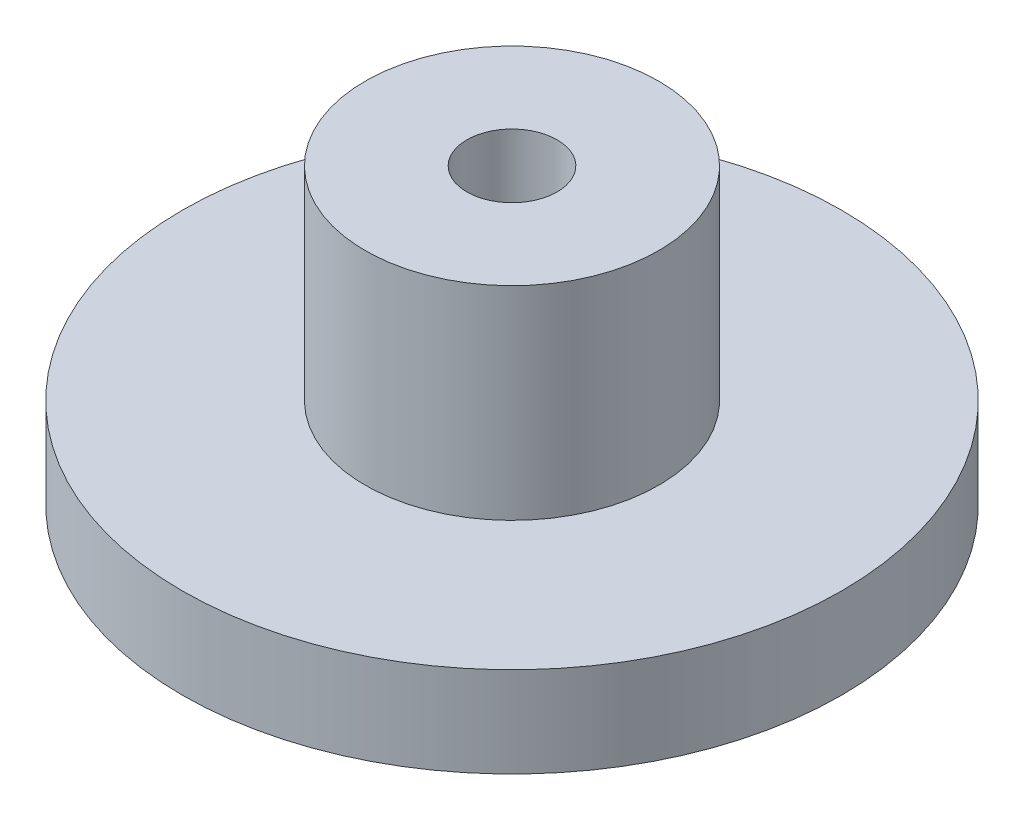
ISO-10303-21;
HEADER;
FILE_DESCRIPTION(('STEP AP214'),'2;1');
FILE_NAME('part.step','',(''),(''),'','','');
FILE_SCHEMA(('AUTOMOTIVE_DESIGN { 1 0 10303 214 1 1 1 1 }'));
ENDSEC;
DATA;
#1=APPLICATION_CONTEXT('core data for automotive mechanical design processes');
#2=APPLICATION_PROTOCOL_DEFINITION('international standard','automotive_design',2000,#1);
#3=PRODUCT_CONTEXT('',#1,'mechanical');
#4=PRODUCT('Part','Part','',(#3));
#5=PRODUCT_RELATED_PRODUCT_CATEGORY('part','',(#4));
#6=PRODUCT_DEFINITION_FORMATION('','',#4);
#7=PRODUCT_DEFINITION_CONTEXT('part definition',#1,'design');
#8=PRODUCT_DEFINITION('design','',#6,#7);
#9=PRODUCT_DEFINITION_SHAPE('','',#8);
#10=(LENGTH_UNIT() NAMED_UNIT(*) SI_UNIT(.MILLI.,.METRE.));
#11=(NAMED_UNIT(*) PLANE_ANGLE_UNIT() SI_UNIT($,.RADIAN.));
#12=(NAMED_UNIT(*) SI_UNIT($,.STERADIAN.) SOLID_ANGLE_UNIT());
#13=UNCERTAINTY_MEASURE_WITH_UNIT(LENGTH_MEASURE(1.E-05),#10,'distance_accuracy_value','');
#14=(GEOMETRIC_REPRESENTATION_CONTEXT(3) GLOBAL_UNCERTAINTY_ASSIGNED_CONTEXT((#13)) GLOBAL_UNIT_ASSIGNED_CONTEXT((#10,
#11,#12)) REPRESENTATION_CONTEXT('',''));
#15=CARTESIAN_POINT('',(0.,0.,0.));
#16=DIRECTION('',(0.,0.,1.));
#17=DIRECTION('',(1.,0.,0.));
#18=AXIS2_PLACEMENT_3D('',#15,#16,#17);
#19=CARTESIAN_POINT('',(3.25,6.5,0.));
#20=DIRECTION('',(0.,1.,0.));
#21=DIRECTION('',(0.,0.,1.));
#22=AXIS2_PLACEMENT_3D('',#19,#20,#21);
#23=PLANE('',#22);
#24=CARTESIAN_POINT('',(0.,6.5,0.));
#25=DIRECTION('',(0.,-1.,0.));
#26=DIRECTION('',(0.,0.,-1.));
#27=AXIS2_PLACEMENT_3D('',#24,#25,#26);
#28=CIRCLE('',#27,1.);
#29=CARTESIAN_POINT('',(0.,6.5,-1.));
#30=VERTEX_POINT('',#29);
#31=EDGE_CURVE('E10',#30,#30,#28,.T.);
#32=ORIENTED_EDGE('',*,*,#31,.T.);
#33=EDGE_LOOP('',(#32));
#34=FACE_BOUND('',#33,.T.);
#35=CARTESIAN_POINT('',(0.,6.5,0.));
#36=DIRECTION('',(0.,-1.,0.));
#37=DIRECTION('',(0.,0.,-1.));
#38=AXIS2_PLACEMENT_3D('',#35,#36,#37);
#39=CIRCLE('',#38,3.25);
#40=CARTESIAN_POINT('',(0.,6.5,-3.25));
#41=VERTEX_POINT('',#40);
#42=EDGE_CURVE('E76',#41,#41,#39,.T.);
#43=ORIENTED_EDGE('',*,*,#42,.F.);
#44=EDGE_LOOP('',(#43));
#45=FACE_BOUND('',#44,.T.);
#46=ADVANCED_FACE('F36',(#34,#45),#23,.T.);
#47=CARTESIAN_POINT('',(0.,0.,0.));
#48=DIRECTION('',(0.,-1.,0.));
#49=DIRECTION('',(0.,0.,-1.));
#50=AXIS2_PLACEMENT_3D('',#47,#48,#49);
#51=CYLINDRICAL_SURFACE('',#50,1.);
#52=CARTESIAN_POINT('',(0.,0.,0.));
#53=DIRECTION('',(0.,-1.,0.));
#54=DIRECTION('',(0.,0.,-1.));
#55=AXIS2_PLACEMENT_3D('',#52,#53,#54);
#56=CIRCLE('',#55,1.);
#57=CARTESIAN_POINT('',(0.,0.,-1.));
#58=VERTEX_POINT('',#57);
#59=EDGE_CURVE('E43',#58,#58,#56,.T.);
#60=ORIENTED_EDGE('',*,*,#59,.T.);
#61=EDGE_LOOP('',(#60));
#62=FACE_BOUND('',#61,.T.);
#63=ORIENTED_EDGE('',*,*,#31,.F.);
#64=EDGE_LOOP('',(#63));
#65=FACE_BOUND('',#64,.T.);
#66=ADVANCED_FACE('F84',(#62,#65),#51,.F.);
#67=CARTESIAN_POINT('',(1.,0.,0.));
#68=DIRECTION('',(0.,-1.,0.));
#69=DIRECTION('',(0.,0.,-1.));
#70=AXIS2_PLACEMENT_3D('',#67,#68,#69);
#71=PLANE('',#70);
#72=CARTESIAN_POINT('',(0.,0.,0.));
#73=DIRECTION('',(0.,-1.,0.));
#74=DIRECTION('',(0.,0.,-1.));
#75=AXIS2_PLACEMENT_3D('',#72,#73,#74);
#76=CIRCLE('',#75,2.5);
#77=CARTESIAN_POINT('',(0.,0.,-2.5));
#78=VERTEX_POINT('',#77);
#79=EDGE_CURVE('E49',#78,#78,#76,.T.);
#80=ORIENTED_EDGE('',*,*,#79,.T.);
#81=EDGE_LOOP('',(#80));
#82=FACE_BOUND('',#81,.T.);
#83=ORIENTED_EDGE('',*,*,#59,.F.);
#84=EDGE_LOOP('',(#83));
#85=FACE_BOUND('',#84,.T.);
#86=ADVANCED_FACE('F88',(#82,#85),#71,.T.);
#87=CARTESIAN_POINT('',(0.,0.,0.));
#88=DIRECTION('',(0.,-1.,0.));
#89=DIRECTION('',(0.,0.,-1.));
#90=AXIS2_PLACEMENT_3D('',#87,#88,#89);
#91=CYLINDRICAL_SURFACE('',#90,2.5);
#92=CARTESIAN_POINT('',(0.,0.6,0.));
#93=DIRECTION('',(0.,-1.,0.));
#94=DIRECTION('',(0.,0.,-1.));
#95=AXIS2_PLACEMENT_3D('',#92,#93,#94);
#96=CIRCLE('',#95,2.5);
#97=CARTESIAN_POINT('',(0.,0.6,-2.5));
#98=VERTEX_POINT('',#97);
#99=EDGE_CURVE('E53',#98,#98,#96,.T.);
#100=ORIENTED_EDGE('',*,*,#99,.T.);
#101=EDGE_LOOP('',(#100));
#102=FACE_BOUND('',#101,.T.);
#103=ORIENTED_EDGE('',*,*,#79,.F.);
#104=EDGE_LOOP('',(#103));
#105=FACE_BOUND('',#104,.T.);
#106=ADVANCED_FACE('F92',(#102,#105),#91,.T.);
#107=CARTESIAN_POINT('',(2.5,0.6,0.));
#108=DIRECTION('',(0.,-1.,0.));
#109=DIRECTION('',(0.,0.,-1.));
#110=AXIS2_PLACEMENT_3D('',#107,#108,#109);
#111=PLANE('',#110);
#112=CARTESIAN_POINT('',(0.,0.6,0.));
#113=DIRECTION('',(0.,-1.,0.));
#114=DIRECTION('',(0.,0.,-1.));
#115=AXIS2_PLACEMENT_3D('',#112,#113,#114);
#116=CIRCLE('',#115,5.5);
#117=CARTESIAN_POINT('',(0.,0.6,-5.5));
#118=VERTEX_POINT('',#117);
#119=EDGE_CURVE('E58',#118,#118,#116,.T.);
#120=ORIENTED_EDGE('',*,*,#119,.T.);
#121=EDGE_LOOP('',(#120));
#122=FACE_BOUND('',#121,.T.);
#123=ORIENTED_EDGE('',*,*,#99,.F.);
#124=EDGE_LOOP('',(#123));
#125=FACE_BOUND('',#124,.T.);
#126=ADVANCED_FACE('F99',(#122,#125),#111,.T.);
#127=CARTESIAN_POINT('',(0.,0.,0.));
#128=DIRECTION('',(0.,-1.,0.));
#129=DIRECTION('',(0.,0.,-1.));
#130=AXIS2_PLACEMENT_3D('',#127,#128,#129);
#131=CYLINDRICAL_SURFACE('',#130,5.5);
#132=CARTESIAN_POINT('',(0.,0.,0.));
#133=DIRECTION('',(0.,-1.,0.));
#134=DIRECTION('',(0.,0.,-1.));
#135=AXIS2_PLACEMENT_3D('',#132,#133,#134);
#136=CIRCLE('',#135,5.5);
#137=CARTESIAN_POINT('',(0.,0.,-5.5));
#138=VERTEX_POINT('',#137);
#139=EDGE_CURVE('E62',#138,#138,#136,.T.);
#140=ORIENTED_EDGE('',*,*,#139,.T.);
#141=EDGE_LOOP('',(#140));
#142=FACE_BOUND('',#141,.T.);
#143=ORIENTED_EDGE('',*,*,#119,.F.);
#144=EDGE_LOOP('',(#143));
#145=FACE_BOUND('',#144,.T.);
#146=ADVANCED_FACE('F103',(#142,#145),#131,.F.);
#147=CARTESIAN_POINT('',(5.5,0.,0.));
#148=DIRECTION('',(0.,-1.,0.));
#149=DIRECTION('',(0.,0.,-1.));
#150=AXIS2_PLACEMENT_3D('',#147,#148,#149);
#151=PLANE('',#150);
#152=CARTESIAN_POINT('',(0.,0.,0.));
#153=DIRECTION('',(0.,-1.,0.));
#154=DIRECTION('',(0.,0.,-1.));
#155=AXIS2_PLACEMENT_3D('',#152,#153,#154);
#156=CIRCLE('',#155,7.3);
#157=CARTESIAN_POINT('',(0.,0.,-7.3));
#158=VERTEX_POINT('',#157);
#159=EDGE_CURVE('E66',#158,#158,#156,.T.);
#160=ORIENTED_EDGE('',*,*,#159,.T.);
#161=EDGE_LOOP('',(#160));
#162=FACE_BOUND('',#161,.T.);
#163=ORIENTED_EDGE('',*,*,#139,.F.);
#164=EDGE_LOOP('',(#163));
#165=FACE_BOUND('',#164,.T.);
#166=ADVANCED_FACE('F107',(#162,#165),#151,.T.);
#167=CARTESIAN_POINT('',(0.,0.,0.));
#168=DIRECTION('',(0.,-1.,0.));
#169=DIRECTION('',(0.,0.,-1.));
#170=AXIS2_PLACEMENT_3D('',#167,#168,#169);
#171=CYLINDRICAL_SURFACE('',#170,7.3);
#172=CARTESIAN_POINT('',(0.,2.,0.));
#173=DIRECTION('',(0.,-1.,0.));
#174=DIRECTION('',(0.,0.,-1.));
#175=AXIS2_PLACEMENT_3D('',#172,#173,#174);
#176=CIRCLE('',#175,7.3);
#177=CARTESIAN_POINT('',(0.,2.,-7.3));
#178=VERTEX_POINT('',#177);
#179=EDGE_CURVE('E69',#178,#178,#176,.T.);
#180=ORIENTED_EDGE('',*,*,#179,.T.);
#181=EDGE_LOOP('',(#180));
#182=FACE_BOUND('',#181,.T.);
#183=ORIENTED_EDGE('',*,*,#159,.F.);
#184=EDGE_LOOP('',(#183));
#185=FACE_BOUND('',#184,.T.);
#186=ADVANCED_FACE('F111',(#182,#185),#171,.T.);
#187=CARTESIAN_POINT('',(7.3,2.,0.));
#188=DIRECTION('',(0.,1.,0.));
#189=DIRECTION('',(0.,0.,1.));
#190=AXIS2_PLACEMENT_3D('',#187,#188,#189);
#191=PLANE('',#190);
#192=CARTESIAN_POINT('',(0.,2.,0.));
#193=DIRECTION('',(0.,-1.,0.));
#194=DIRECTION('',(0.,0.,-1.));
#195=AXIS2_PLACEMENT_3D('',#192,#193,#194);
#196=CIRCLE('',#195,3.25);
#197=CARTESIAN_POINT('',(0.,2.,-3.25));
#198=VERTEX_POINT('',#197);
#199=EDGE_CURVE('E73',#198,#198,#196,.T.);
#200=ORIENTED_EDGE('',*,*,#199,.T.);
#201=EDGE_LOOP('',(#200));
#202=FACE_BOUND('',#201,.T.);
#203=ORIENTED_EDGE('',*,*,#179,.F.);
#204=EDGE_LOOP('',(#203));
#205=FACE_BOUND('',#204,.T.);
#206=ADVANCED_FACE('F115',(#202,#205),#191,.T.);
#207=CARTESIAN_POINT('',(0.,0.,0.));
#208=DIRECTION('',(0.,-1.,0.));
#209=DIRECTION('',(0.,0.,-1.));
#210=AXIS2_PLACEMENT_3D('',#207,#208,#209);
#211=CYLINDRICAL_SURFACE('',#210,3.25);
#212=ORIENTED_EDGE('',*,*,#42,.T.);
#213=EDGE_LOOP('',(#212));
#214=FACE_BOUND('',#213,.T.);
#215=ORIENTED_EDGE('',*,*,#199,.F.);
#216=EDGE_LOOP('',(#215));
#217=FACE_BOUND('',#216,.T.);
#218=ADVANCED_FACE('F80',(#214,#217),#211,.T.);
#219=CLOSED_SHELL('',(#46,#66,#86,#106,#126,#146,#166,#186,#206,#218));
#220=MANIFOLD_SOLID_BREP('B2',#219);
#221=ADVANCED_BREP_SHAPE_REPRESENTATION('',(#18,#220),#14);
#222=SHAPE_DEFINITION_REPRESENTATION(#9,#221);
ENDSEC;
END-ISO-10303-21;
